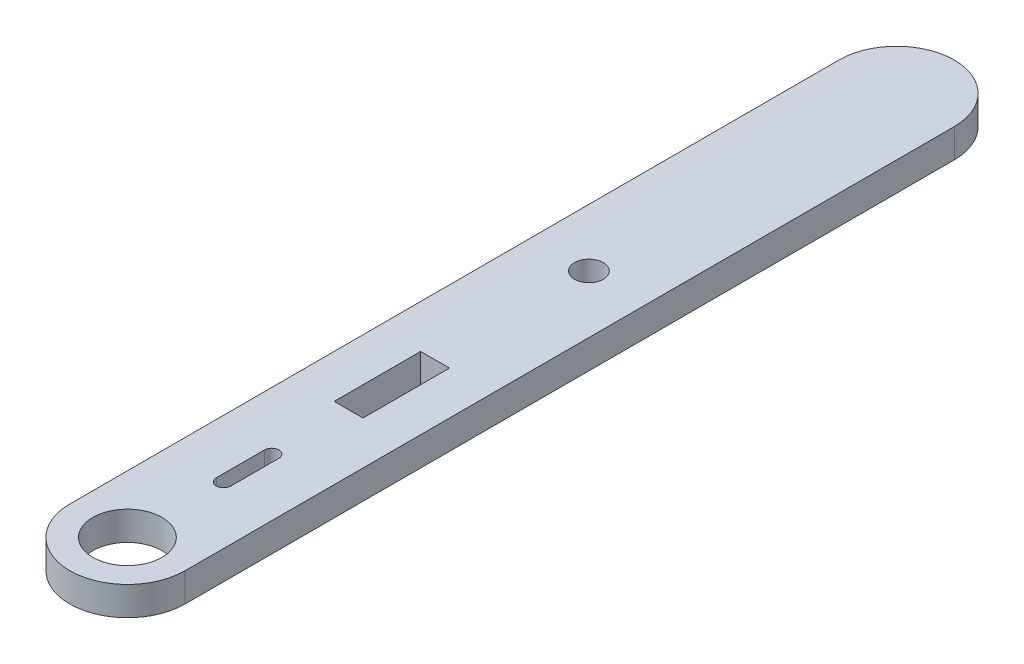
ISO-10303-21;
HEADER;
FILE_DESCRIPTION(('STEP AP214'),'2;1');
FILE_NAME('part.step','',(''),(''),'','','');
FILE_SCHEMA(('AUTOMOTIVE_DESIGN { 1 0 10303 214 1 1 1 1 }'));
ENDSEC;
DATA;
#1=APPLICATION_CONTEXT('core data for automotive mechanical design processes');
#2=APPLICATION_PROTOCOL_DEFINITION('international standard','automotive_design',2000,#1);
#3=PRODUCT_CONTEXT('',#1,'mechanical');
#4=PRODUCT('Part','Part','',(#3));
#5=PRODUCT_RELATED_PRODUCT_CATEGORY('part','',(#4));
#6=PRODUCT_DEFINITION_FORMATION('','',#4);
#7=PRODUCT_DEFINITION_CONTEXT('part definition',#1,'design');
#8=PRODUCT_DEFINITION('design','',#6,#7);
#9=PRODUCT_DEFINITION_SHAPE('','',#8);
#10=(LENGTH_UNIT() NAMED_UNIT(*) SI_UNIT(.MILLI.,.METRE.));
#11=(NAMED_UNIT(*) PLANE_ANGLE_UNIT() SI_UNIT($,.RADIAN.));
#12=(NAMED_UNIT(*) SI_UNIT($,.STERADIAN.) SOLID_ANGLE_UNIT());
#13=UNCERTAINTY_MEASURE_WITH_UNIT(LENGTH_MEASURE(1.E-05),#10,'distance_accuracy_value','');
#14=(GEOMETRIC_REPRESENTATION_CONTEXT(3) GLOBAL_UNCERTAINTY_ASSIGNED_CONTEXT((#13)) GLOBAL_UNIT_ASSIGNED_CONTEXT((#10,
#11,#12)) REPRESENTATION_CONTEXT('',''));
#15=CARTESIAN_POINT('',(0.,0.,0.));
#16=DIRECTION('',(0.,0.,1.));
#17=DIRECTION('',(1.,0.,0.));
#18=AXIS2_PLACEMENT_3D('',#15,#16,#17);
#19=CARTESIAN_POINT('',(6.30030000000004,3.,-88.2999260438786));
#20=DIRECTION('',(0.,1.,0.));
#21=DIRECTION('',(0.,0.,1.));
#22=AXIS2_PLACEMENT_3D('',#19,#20,#21);
#23=PLANE('',#22);
#24=CARTESIAN_POINT('',(6.30030000166648,3.,-56.2999760424166));
#25=DIRECTION('',(0.,1.,0.));
#26=DIRECTION('',(0.,0.,1.));
#27=AXIS2_PLACEMENT_3D('',#24,#25,#26);
#28=CIRCLE('',#27,1.50000000166676);
#29=CARTESIAN_POINT('',(6.30030000166648,3.,-54.7999760407499));
#30=VERTEX_POINT('',#29);
#31=EDGE_CURVE('E197',#30,#30,#28,.T.);
#32=ORIENTED_EDGE('',*,*,#31,.F.);
#33=EDGE_LOOP('',(#32));
#34=FACE_BOUND('',#33,.T.);
#35=DIRECTION('',(0.,0.,-1.));
#36=VECTOR('',#35,1.);
#37=CARTESIAN_POINT('',(12.3003,3.,-54.3259692671982));
#38=LINE('',#37,#36);
#39=CARTESIAN_POINT('',(12.3003000000001,3.,-8.29987604400681));
#40=VERTEX_POINT('',#39);
#41=CARTESIAN_POINT('',(12.3003,3.,-88.2998760437166));
#42=VERTEX_POINT('',#41);
#43=EDGE_CURVE('E203',#40,#42,#38,.T.);
#44=ORIENTED_EDGE('',*,*,#43,.T.);
#45=CARTESIAN_POINT('',(6.30030000000004,3.,-88.2999260438786));
#46=DIRECTION('',(0.,1.,0.));
#47=DIRECTION('',(0.,0.,1.));
#48=AXIS2_PLACEMENT_3D('',#45,#46,#47);
#49=CIRCLE('',#48,6.00000000020827);
#50=CARTESIAN_POINT('',(0.30030000000012,3.,-88.2999760440405));
#51=VERTEX_POINT('',#50);
#52=EDGE_CURVE('E205',#42,#51,#49,.T.);
#53=ORIENTED_EDGE('',*,*,#52,.T.);
#54=DIRECTION('',(0.,0.,1.));
#55=VECTOR('',#54,1.);
#56=CARTESIAN_POINT('',(0.300300000000132,3.,-88.2999760440405));
#57=LINE('',#56,#55);
#58=CARTESIAN_POINT('',(0.300300000000172,3.,-8.29987604406613));
#59=VERTEX_POINT('',#58);
#60=EDGE_CURVE('E208',#51,#59,#57,.T.);
#61=ORIENTED_EDGE('',*,*,#60,.T.);
#62=CARTESIAN_POINT('',(6.30030000000012,3.,-8.29992846702468));
#63=DIRECTION('',(0.,1.,0.));
#64=DIRECTION('',(0.,0.,1.));
#65=AXIS2_PLACEMENT_3D('',#62,#63,#64);
#66=CIRCLE('',#65,6.00000000022896);
#67=EDGE_CURVE('E210',#59,#40,#66,.T.);
#68=ORIENTED_EDGE('',*,*,#67,.T.);
#69=EDGE_LOOP('',(#44,#53,#61,#68));
#70=FACE_BOUND('',#69,.T.);
#71=CARTESIAN_POINT('',(6.30029999933328,3.,-8.2998760434166));
#72=DIRECTION('',(0.,1.,0.));
#73=DIRECTION('',(0.,0.,1.));
#74=AXIS2_PLACEMENT_3D('',#71,#72,#73);
#75=CIRCLE('',#74,3.6);
#76=CARTESIAN_POINT('',(6.30029999933328,3.,-4.6998760434166));
#77=VERTEX_POINT('',#76);
#78=EDGE_CURVE('E191',#77,#77,#75,.T.);
#79=ORIENTED_EDGE('',*,*,#78,.F.);
#80=EDGE_LOOP('',(#79));
#81=FACE_BOUND('',#80,.T.);
#82=DIRECTION('',(1.,0.,0.));
#83=VECTOR('',#82,1.);
#84=CARTESIAN_POINT('',(7.8003,3.,-31.2998760440833));
#85=LINE('',#84,#83);
#86=CARTESIAN_POINT('',(4.8003,3.,-31.2998760440833));
#87=VERTEX_POINT('',#86);
#88=CARTESIAN_POINT('',(7.8003,3.,-31.2998760440833));
#89=VERTEX_POINT('',#88);
#90=EDGE_CURVE('E162',#87,#89,#85,.T.);
#91=ORIENTED_EDGE('',*,*,#90,.F.);
#92=DIRECTION('',(0.,0.,1.));
#93=VECTOR('',#92,1.);
#94=CARTESIAN_POINT('',(4.8003,3.,-31.2998760440833));
#95=LINE('',#94,#93);
#96=CARTESIAN_POINT('',(4.8003,3.,-40.2998760440833));
#97=VERTEX_POINT('',#96);
#98=EDGE_CURVE('E160',#97,#87,#95,.T.);
#99=ORIENTED_EDGE('',*,*,#98,.F.);
#100=DIRECTION('',(-1.,0.,0.));
#101=VECTOR('',#100,1.);
#102=CARTESIAN_POINT('',(4.8003,3.,-40.2998760440833));
#103=LINE('',#102,#101);
#104=CARTESIAN_POINT('',(7.8003,3.,-40.2998760440833));
#105=VERTEX_POINT('',#104);
#106=EDGE_CURVE('E168',#105,#97,#103,.T.);
#107=ORIENTED_EDGE('',*,*,#106,.F.);
#108=DIRECTION('',(0.,0.,-1.));
#109=VECTOR('',#108,1.);
#110=CARTESIAN_POINT('',(7.8003,3.,-40.2998760440833));
#111=LINE('',#110,#109);
#112=EDGE_CURVE('E165',#89,#105,#111,.T.);
#113=ORIENTED_EDGE('',*,*,#112,.F.);
#114=EDGE_LOOP('',(#91,#99,#107,#113));
#115=FACE_BOUND('',#114,.T.);
#116=DIRECTION('',(-5.07185826301112E-10,0.,-1.));
#117=VECTOR('',#116,1.);
#118=CARTESIAN_POINT('',(7.05029999975801,3.,-18.2998798547108));
#119=LINE('',#118,#117);
#120=CARTESIAN_POINT('',(7.05029999975801,3.,-18.2998798547108));
#121=VERTEX_POINT('',#120);
#122=CARTESIAN_POINT('',(7.05029999722209,3.,-23.2998760413049));
#123=VERTEX_POINT('',#122);
#124=EDGE_CURVE('E132',#121,#123,#119,.T.);
#125=ORIENTED_EDGE('',*,*,#124,.F.);
#126=CARTESIAN_POINT('',(6.30030000000003,3.,-18.2998989078262));
#127=DIRECTION('',(0.,1.,0.));
#128=DIRECTION('',(0.,0.,1.));
#129=AXIS2_PLACEMENT_3D('',#126,#127,#128);
#130=CIRCLE('',#129,0.749999999999999);
#131=CARTESIAN_POINT('',(5.55030000024204,3.,-18.2998798547092));
#132=VERTEX_POINT('',#131);
#133=EDGE_CURVE('E124',#132,#121,#130,.T.);
#134=ORIENTED_EDGE('',*,*,#133,.F.);
#135=DIRECTION('',(-3.21981240250625E-10,0.,1.));
#136=VECTOR('',#135,1.);
#137=CARTESIAN_POINT('',(5.55030000185197,3.,-23.2999593769527));
#138=LINE('',#137,#136);
#139=CARTESIAN_POINT('',(5.55030000185197,3.,-23.2999593769527));
#140=VERTEX_POINT('',#139);
#141=EDGE_CURVE('E146',#140,#132,#138,.T.);
#142=ORIENTED_EDGE('',*,*,#141,.F.);
#143=CARTESIAN_POINT('',(6.30029999722209,3.,-23.2998760413049));
#144=DIRECTION('',(0.,1.,0.));
#145=DIRECTION('',(0.,0.,1.));
#146=AXIS2_PLACEMENT_3D('',#143,#144,#145);
#147=CIRCLE('',#146,0.749999999999999);
#148=EDGE_CURVE('E144',#123,#140,#147,.T.);
#149=ORIENTED_EDGE('',*,*,#148,.F.);
#150=EDGE_LOOP('',(#125,#134,#142,#149));
#151=FACE_BOUND('',#150,.T.);
#152=ADVANCED_FACE('F35',(#34,#70,#81,#115,#151),#23,.T.);
#153=CARTESIAN_POINT('',(6.30030000000004,0.,-88.2999260438786));
#154=DIRECTION('',(0.,1.,0.));
#155=DIRECTION('',(0.,0.,1.));
#156=AXIS2_PLACEMENT_3D('',#153,#154,#155);
#157=PLANE('',#156);
#158=DIRECTION('',(0.,0.,1.));
#159=VECTOR('',#158,1.);
#160=CARTESIAN_POINT('',(4.8003,0.,-31.2998760440833));
#161=LINE('',#160,#159);
#162=CARTESIAN_POINT('',(4.8003,0.,-40.2998760440833));
#163=VERTEX_POINT('',#162);
#164=CARTESIAN_POINT('',(4.8003,0.,-31.2998760440833));
#165=VERTEX_POINT('',#164);
#166=EDGE_CURVE('E140',#163,#165,#161,.T.);
#167=ORIENTED_EDGE('',*,*,#166,.T.);
#168=DIRECTION('',(1.,0.,0.));
#169=VECTOR('',#168,1.);
#170=CARTESIAN_POINT('',(7.8003,0.,-31.2998760440833));
#171=LINE('',#170,#169);
#172=CARTESIAN_POINT('',(7.8003,0.,-31.2998760440833));
#173=VERTEX_POINT('',#172);
#174=EDGE_CURVE('E173',#165,#173,#171,.T.);
#175=ORIENTED_EDGE('',*,*,#174,.T.);
#176=DIRECTION('',(0.,0.,-1.));
#177=VECTOR('',#176,1.);
#178=CARTESIAN_POINT('',(7.8003,0.,-40.2998760440833));
#179=LINE('',#178,#177);
#180=CARTESIAN_POINT('',(7.8003,0.,-40.2998760440833));
#181=VERTEX_POINT('',#180);
#182=EDGE_CURVE('E176',#173,#181,#179,.T.);
#183=ORIENTED_EDGE('',*,*,#182,.T.);
#184=DIRECTION('',(-1.,0.,0.));
#185=VECTOR('',#184,1.);
#186=CARTESIAN_POINT('',(4.8003,0.,-40.2998760440833));
#187=LINE('',#186,#185);
#188=EDGE_CURVE('E163',#181,#163,#187,.T.);
#189=ORIENTED_EDGE('',*,*,#188,.T.);
#190=EDGE_LOOP('',(#167,#175,#183,#189));
#191=FACE_BOUND('',#190,.T.);
#192=CARTESIAN_POINT('',(6.30030000000004,0.,-88.2999260438786));
#193=DIRECTION('',(0.,1.,0.));
#194=DIRECTION('',(0.,0.,1.));
#195=AXIS2_PLACEMENT_3D('',#192,#193,#194);
#196=CIRCLE('',#195,6.00000000020826);
#197=CARTESIAN_POINT('',(12.3003,0.,-88.2998760437166));
#198=VERTEX_POINT('',#197);
#199=CARTESIAN_POINT('',(0.30030000000012,0.,-88.2999760440405));
#200=VERTEX_POINT('',#199);
#201=EDGE_CURVE('E200',#198,#200,#196,.T.);
#202=ORIENTED_EDGE('',*,*,#201,.F.);
#203=DIRECTION('',(0.,0.,-1.));
#204=VECTOR('',#203,1.);
#205=CARTESIAN_POINT('',(12.3003,0.,-21.9746347267356));
#206=LINE('',#205,#204);
#207=CARTESIAN_POINT('',(12.3003000000001,0.,-8.29987604400681));
#208=VERTEX_POINT('',#207);
#209=EDGE_CURVE('E206',#208,#198,#206,.T.);
#210=ORIENTED_EDGE('',*,*,#209,.F.);
#211=CARTESIAN_POINT('',(6.30030000000012,0.,-8.29992846702468));
#212=DIRECTION('',(0.,1.,0.));
#213=DIRECTION('',(0.,0.,1.));
#214=AXIS2_PLACEMENT_3D('',#211,#212,#213);
#215=CIRCLE('',#214,6.00000000022896);
#216=CARTESIAN_POINT('',(0.300300000000172,0.,-8.29987604406613));
#217=VERTEX_POINT('',#216);
#218=EDGE_CURVE('E217',#217,#208,#215,.T.);
#219=ORIENTED_EDGE('',*,*,#218,.F.);
#220=DIRECTION('',(0.,0.,1.));
#221=VECTOR('',#220,1.);
#222=CARTESIAN_POINT('',(0.300300000000132,0.,-88.2999760440405));
#223=LINE('',#222,#221);
#224=EDGE_CURVE('E215',#200,#217,#223,.T.);
#225=ORIENTED_EDGE('',*,*,#224,.F.);
#226=EDGE_LOOP('',(#202,#210,#219,#225));
#227=FACE_BOUND('',#226,.T.);
#228=CARTESIAN_POINT('',(6.30030000166648,0.,-56.2999760424166));
#229=DIRECTION('',(0.,1.,0.));
#230=DIRECTION('',(0.,0.,1.));
#231=AXIS2_PLACEMENT_3D('',#228,#229,#230);
#232=CIRCLE('',#231,1.50000000166676);
#233=CARTESIAN_POINT('',(6.30030000166648,0.,-54.7999760407499));
#234=VERTEX_POINT('',#233);
#235=EDGE_CURVE('E194',#234,#234,#232,.T.);
#236=ORIENTED_EDGE('',*,*,#235,.T.);
#237=EDGE_LOOP('',(#236));
#238=FACE_BOUND('',#237,.T.);
#239=CARTESIAN_POINT('',(6.30029999933328,0.,-8.2998760434166));
#240=DIRECTION('',(0.,1.,0.));
#241=DIRECTION('',(0.,0.,1.));
#242=AXIS2_PLACEMENT_3D('',#239,#240,#241);
#243=CIRCLE('',#242,3.6);
#244=CARTESIAN_POINT('',(6.30029999933328,0.,-4.6998760434166));
#245=VERTEX_POINT('',#244);
#246=EDGE_CURVE('E190',#245,#245,#243,.T.);
#247=ORIENTED_EDGE('',*,*,#246,.T.);
#248=EDGE_LOOP('',(#247));
#249=FACE_BOUND('',#248,.T.);
#250=CARTESIAN_POINT('',(6.30030000000003,0.,-18.2998989078262));
#251=DIRECTION('',(0.,1.,0.));
#252=DIRECTION('',(0.,0.,1.));
#253=AXIS2_PLACEMENT_3D('',#250,#251,#252);
#254=CIRCLE('',#253,0.749999999999999);
#255=CARTESIAN_POINT('',(5.55030000024204,0.,-18.2998798547092));
#256=VERTEX_POINT('',#255);
#257=CARTESIAN_POINT('',(7.05029999975801,0.,-18.2998798547108));
#258=VERTEX_POINT('',#257);
#259=EDGE_CURVE('E58',#256,#258,#254,.T.);
#260=ORIENTED_EDGE('',*,*,#259,.T.);
#261=DIRECTION('',(-5.07185826301112E-10,0.,-1.));
#262=VECTOR('',#261,1.);
#263=CARTESIAN_POINT('',(7.05029999975801,0.,-18.2998798547108));
#264=LINE('',#263,#262);
#265=CARTESIAN_POINT('',(7.05029999722209,0.,-23.2998760413049));
#266=VERTEX_POINT('',#265);
#267=EDGE_CURVE('E139',#258,#266,#264,.T.);
#268=ORIENTED_EDGE('',*,*,#267,.T.);
#269=CARTESIAN_POINT('',(6.30029999722209,0.,-23.2998760413049));
#270=DIRECTION('',(0.,1.,0.));
#271=DIRECTION('',(0.,0.,1.));
#272=AXIS2_PLACEMENT_3D('',#269,#270,#271);
#273=CIRCLE('',#272,0.749999999999999);
#274=CARTESIAN_POINT('',(5.55030000185197,0.,-23.2999593769527));
#275=VERTEX_POINT('',#274);
#276=EDGE_CURVE('E152',#266,#275,#273,.T.);
#277=ORIENTED_EDGE('',*,*,#276,.T.);
#278=DIRECTION('',(-3.21981240250625E-10,0.,1.));
#279=VECTOR('',#278,1.);
#280=CARTESIAN_POINT('',(5.55030000185197,0.,-23.2999593769527));
#281=LINE('',#280,#279);
#282=EDGE_CURVE('E133',#275,#256,#281,.T.);
#283=ORIENTED_EDGE('',*,*,#282,.T.);
#284=EDGE_LOOP('',(#260,#268,#277,#283));
#285=FACE_BOUND('',#284,.T.);
#286=ADVANCED_FACE('F237',(#191,#227,#238,#249,#285),#157,.F.);
#287=CARTESIAN_POINT('',(6.30030000000004,3.,-88.2999260438786));
#288=DIRECTION('',(0.,-1.,0.));
#289=DIRECTION('',(0.,0.,-1.));
#290=AXIS2_PLACEMENT_3D('',#287,#288,#289);
#291=CYLINDRICAL_SURFACE('',#290,6.00000000020826);
#292=ORIENTED_EDGE('',*,*,#201,.T.);
#293=DIRECTION('',(0.,-1.,0.));
#294=VECTOR('',#293,1.);
#295=CARTESIAN_POINT('',(0.30030000000012,3.,-88.2999760440405));
#296=LINE('',#295,#294);
#297=EDGE_CURVE('E43',#51,#200,#296,.T.);
#298=ORIENTED_EDGE('',*,*,#297,.F.);
#299=ORIENTED_EDGE('',*,*,#52,.F.);
#300=DIRECTION('',(0.,-1.,0.));
#301=VECTOR('',#300,1.);
#302=CARTESIAN_POINT('',(12.3003,3.,-88.2998760437166));
#303=LINE('',#302,#301);
#304=EDGE_CURVE('E11',#42,#198,#303,.T.);
#305=ORIENTED_EDGE('',*,*,#304,.T.);
#306=EDGE_LOOP('',(#292,#298,#299,#305));
#307=FACE_BOUND('',#306,.T.);
#308=ADVANCED_FACE('F37',(#307),#291,.T.);
#309=CARTESIAN_POINT('',(0.300300000000132,3.,-88.2999760440405));
#310=DIRECTION('',(1.,0.,0.));
#311=DIRECTION('',(0.,0.,-1.));
#312=AXIS2_PLACEMENT_3D('',#309,#310,#311);
#313=PLANE('',#312);
#314=ORIENTED_EDGE('',*,*,#224,.T.);
#315=DIRECTION('',(0.,-1.,0.));
#316=VECTOR('',#315,1.);
#317=CARTESIAN_POINT('',(0.300300000000172,3.,-8.29987604406613));
#318=LINE('',#317,#316);
#319=EDGE_CURVE('E223',#59,#217,#318,.T.);
#320=ORIENTED_EDGE('',*,*,#319,.F.);
#321=ORIENTED_EDGE('',*,*,#60,.F.);
#322=ORIENTED_EDGE('',*,*,#297,.T.);
#323=EDGE_LOOP('',(#314,#320,#321,#322));
#324=FACE_BOUND('',#323,.T.);
#325=ADVANCED_FACE('F230',(#324),#313,.F.);
#326=CARTESIAN_POINT('',(6.30030000000012,3.,-8.29992846702468));
#327=DIRECTION('',(0.,-1.,0.));
#328=DIRECTION('',(0.,0.,-1.));
#329=AXIS2_PLACEMENT_3D('',#326,#327,#328);
#330=CYLINDRICAL_SURFACE('',#329,6.00000000022896);
#331=ORIENTED_EDGE('',*,*,#218,.T.);
#332=DIRECTION('',(0.,-1.,0.));
#333=VECTOR('',#332,1.);
#334=CARTESIAN_POINT('',(12.3003000000001,3.,-8.29987604400681));
#335=LINE('',#334,#333);
#336=EDGE_CURVE('E213',#40,#208,#335,.T.);
#337=ORIENTED_EDGE('',*,*,#336,.F.);
#338=ORIENTED_EDGE('',*,*,#67,.F.);
#339=ORIENTED_EDGE('',*,*,#319,.T.);
#340=EDGE_LOOP('',(#331,#337,#338,#339));
#341=FACE_BOUND('',#340,.T.);
#342=ADVANCED_FACE('F241',(#341),#330,.T.);
#343=CARTESIAN_POINT('',(12.3003,3.,-21.9746347267356));
#344=DIRECTION('',(-1.,0.,0.));
#345=DIRECTION('',(0.,0.,1.));
#346=AXIS2_PLACEMENT_3D('',#343,#344,#345);
#347=PLANE('',#346);
#348=ORIENTED_EDGE('',*,*,#209,.T.);
#349=ORIENTED_EDGE('',*,*,#304,.F.);
#350=ORIENTED_EDGE('',*,*,#43,.F.);
#351=ORIENTED_EDGE('',*,*,#336,.T.);
#352=EDGE_LOOP('',(#348,#349,#350,#351));
#353=FACE_BOUND('',#352,.T.);
#354=ADVANCED_FACE('F244',(#353),#347,.F.);
#355=CARTESIAN_POINT('',(6.30030000166648,3.,-56.2999760424166));
#356=DIRECTION('',(0.,-1.,0.));
#357=DIRECTION('',(0.,0.,-1.));
#358=AXIS2_PLACEMENT_3D('',#355,#356,#357);
#359=CYLINDRICAL_SURFACE('',#358,1.50000000166676);
#360=ORIENTED_EDGE('',*,*,#31,.T.);
#361=EDGE_LOOP('',(#360));
#362=FACE_BOUND('',#361,.T.);
#363=ORIENTED_EDGE('',*,*,#235,.F.);
#364=EDGE_LOOP('',(#363));
#365=FACE_BOUND('',#364,.T.);
#366=ADVANCED_FACE('F262',(#362,#365),#359,.F.);
#367=CARTESIAN_POINT('',(6.30029999933328,3.,-8.2998760434166));
#368=DIRECTION('',(0.,-1.,0.));
#369=DIRECTION('',(0.,0.,-1.));
#370=AXIS2_PLACEMENT_3D('',#367,#368,#369);
#371=CYLINDRICAL_SURFACE('',#370,3.6);
#372=ORIENTED_EDGE('',*,*,#78,.T.);
#373=EDGE_LOOP('',(#372));
#374=FACE_BOUND('',#373,.T.);
#375=ORIENTED_EDGE('',*,*,#246,.F.);
#376=EDGE_LOOP('',(#375));
#377=FACE_BOUND('',#376,.T.);
#378=ADVANCED_FACE('F282',(#374,#377),#371,.F.);
#379=CARTESIAN_POINT('',(4.8003,3.,-31.2998760440833));
#380=DIRECTION('',(1.,0.,0.));
#381=DIRECTION('',(0.,0.,-1.));
#382=AXIS2_PLACEMENT_3D('',#379,#380,#381);
#383=PLANE('',#382);
#384=ORIENTED_EDGE('',*,*,#166,.F.);
#385=DIRECTION('',(0.,-1.,0.));
#386=VECTOR('',#385,1.);
#387=CARTESIAN_POINT('',(4.8003,3.,-40.2998760440833));
#388=LINE('',#387,#386);
#389=EDGE_CURVE('E170',#97,#163,#388,.T.);
#390=ORIENTED_EDGE('',*,*,#389,.F.);
#391=ORIENTED_EDGE('',*,*,#98,.T.);
#392=DIRECTION('',(0.,-1.,0.));
#393=VECTOR('',#392,1.);
#394=CARTESIAN_POINT('',(4.8003,3.,-31.2998760440833));
#395=LINE('',#394,#393);
#396=EDGE_CURVE('E187',#87,#165,#395,.T.);
#397=ORIENTED_EDGE('',*,*,#396,.T.);
#398=EDGE_LOOP('',(#384,#390,#391,#397));
#399=FACE_BOUND('',#398,.T.);
#400=ADVANCED_FACE('F289',(#399),#383,.T.);
#401=CARTESIAN_POINT('',(7.8003,3.,-31.2998760440833));
#402=DIRECTION('',(0.,0.,-1.));
#403=DIRECTION('',(-1.,0.,0.));
#404=AXIS2_PLACEMENT_3D('',#401,#402,#403);
#405=PLANE('',#404);
#406=ORIENTED_EDGE('',*,*,#174,.F.);
#407=ORIENTED_EDGE('',*,*,#396,.F.);
#408=ORIENTED_EDGE('',*,*,#90,.T.);
#409=DIRECTION('',(0.,-1.,0.));
#410=VECTOR('',#409,1.);
#411=CARTESIAN_POINT('',(7.8003,3.,-31.2998760440833));
#412=LINE('',#411,#410);
#413=EDGE_CURVE('E185',#89,#173,#412,.T.);
#414=ORIENTED_EDGE('',*,*,#413,.T.);
#415=EDGE_LOOP('',(#406,#407,#408,#414));
#416=FACE_BOUND('',#415,.T.);
#417=ADVANCED_FACE('F296',(#416),#405,.T.);
#418=CARTESIAN_POINT('',(7.8003,3.,-40.2998760440833));
#419=DIRECTION('',(-1.,0.,0.));
#420=DIRECTION('',(0.,0.,1.));
#421=AXIS2_PLACEMENT_3D('',#418,#419,#420);
#422=PLANE('',#421);
#423=ORIENTED_EDGE('',*,*,#182,.F.);
#424=ORIENTED_EDGE('',*,*,#413,.F.);
#425=ORIENTED_EDGE('',*,*,#112,.T.);
#426=DIRECTION('',(0.,-1.,0.));
#427=VECTOR('',#426,1.);
#428=CARTESIAN_POINT('',(7.8003,3.,-40.2998760440833));
#429=LINE('',#428,#427);
#430=EDGE_CURVE('E183',#105,#181,#429,.T.);
#431=ORIENTED_EDGE('',*,*,#430,.T.);
#432=EDGE_LOOP('',(#423,#424,#425,#431));
#433=FACE_BOUND('',#432,.T.);
#434=ADVANCED_FACE('F304',(#433),#422,.T.);
#435=CARTESIAN_POINT('',(4.8003,3.,-40.2998760440833));
#436=DIRECTION('',(0.,0.,1.));
#437=DIRECTION('',(1.,0.,0.));
#438=AXIS2_PLACEMENT_3D('',#435,#436,#437);
#439=PLANE('',#438);
#440=ORIENTED_EDGE('',*,*,#188,.F.);
#441=ORIENTED_EDGE('',*,*,#430,.F.);
#442=ORIENTED_EDGE('',*,*,#106,.T.);
#443=ORIENTED_EDGE('',*,*,#389,.T.);
#444=EDGE_LOOP('',(#440,#441,#442,#443));
#445=FACE_BOUND('',#444,.T.);
#446=ADVANCED_FACE('F312',(#445),#439,.T.);
#447=CARTESIAN_POINT('',(6.30030000000003,3.,-18.2998989078262));
#448=DIRECTION('',(0.,-1.,0.));
#449=DIRECTION('',(0.,0.,-1.));
#450=AXIS2_PLACEMENT_3D('',#447,#448,#449);
#451=CYLINDRICAL_SURFACE('',#450,0.749999999999999);
#452=ORIENTED_EDGE('',*,*,#259,.F.);
#453=DIRECTION('',(0.,-1.,0.));
#454=VECTOR('',#453,1.);
#455=CARTESIAN_POINT('',(5.55030000024204,3.,-18.2998798547092));
#456=LINE('',#455,#454);
#457=EDGE_CURVE('E128',#132,#256,#456,.T.);
#458=ORIENTED_EDGE('',*,*,#457,.F.);
#459=ORIENTED_EDGE('',*,*,#133,.T.);
#460=DIRECTION('',(0.,-1.,0.));
#461=VECTOR('',#460,1.);
#462=CARTESIAN_POINT('',(7.05029999975801,3.,-18.2998798547108));
#463=LINE('',#462,#461);
#464=EDGE_CURVE('E127',#121,#258,#463,.T.);
#465=ORIENTED_EDGE('',*,*,#464,.T.);
#466=EDGE_LOOP('',(#452,#458,#459,#465));
#467=FACE_BOUND('',#466,.T.);
#468=ADVANCED_FACE('F126',(#467),#451,.F.);
#469=CARTESIAN_POINT('',(7.05029999975801,3.,-18.2998798547108));
#470=DIRECTION('',(-1.,0.,5.07185826301112E-10));
#471=DIRECTION('',(5.07185826301112E-10,0.,1.));
#472=AXIS2_PLACEMENT_3D('',#469,#470,#471);
#473=PLANE('',#472);
#474=ORIENTED_EDGE('',*,*,#267,.F.);
#475=ORIENTED_EDGE('',*,*,#464,.F.);
#476=ORIENTED_EDGE('',*,*,#124,.T.);
#477=DIRECTION('',(0.,-1.,0.));
#478=VECTOR('',#477,1.);
#479=CARTESIAN_POINT('',(7.05029999722209,3.,-23.2998760413049));
#480=LINE('',#479,#478);
#481=EDGE_CURVE('E141',#123,#266,#480,.T.);
#482=ORIENTED_EDGE('',*,*,#481,.T.);
#483=EDGE_LOOP('',(#474,#475,#476,#482));
#484=FACE_BOUND('',#483,.T.);
#485=ADVANCED_FACE('F136',(#484),#473,.T.);
#486=CARTESIAN_POINT('',(6.30029999722209,3.,-23.2998760413049));
#487=DIRECTION('',(0.,-1.,0.));
#488=DIRECTION('',(0.,0.,-1.));
#489=AXIS2_PLACEMENT_3D('',#486,#487,#488);
#490=CYLINDRICAL_SURFACE('',#489,0.749999999999999);
#491=ORIENTED_EDGE('',*,*,#276,.F.);
#492=ORIENTED_EDGE('',*,*,#481,.F.);
#493=ORIENTED_EDGE('',*,*,#148,.T.);
#494=DIRECTION('',(0.,-1.,0.));
#495=VECTOR('',#494,1.);
#496=CARTESIAN_POINT('',(5.55030000185197,3.,-23.2999593769527));
#497=LINE('',#496,#495);
#498=EDGE_CURVE('E50',#140,#275,#497,.T.);
#499=ORIENTED_EDGE('',*,*,#498,.T.);
#500=EDGE_LOOP('',(#491,#492,#493,#499));
#501=FACE_BOUND('',#500,.T.);
#502=ADVANCED_FACE('F333',(#501),#490,.F.);
#503=CARTESIAN_POINT('',(5.55030000185197,3.,-23.2999593769527));
#504=DIRECTION('',(1.,0.,3.21981240250625E-10));
#505=DIRECTION('',(3.21981240250625E-10,0.,-1.));
#506=AXIS2_PLACEMENT_3D('',#503,#504,#505);
#507=PLANE('',#506);
#508=ORIENTED_EDGE('',*,*,#282,.F.);
#509=ORIENTED_EDGE('',*,*,#498,.F.);
#510=ORIENTED_EDGE('',*,*,#141,.T.);
#511=ORIENTED_EDGE('',*,*,#457,.T.);
#512=EDGE_LOOP('',(#508,#509,#510,#511));
#513=FACE_BOUND('',#512,.T.);
#514=ADVANCED_FACE('F340',(#513),#507,.T.);
#515=CLOSED_SHELL('',(#152,#286,#308,#325,#342,#354,#366,#378,#400,#417,#434,#446,#468,#485,
#502,#514));
#516=MANIFOLD_SOLID_BREP('B2',#515);
#517=ADVANCED_BREP_SHAPE_REPRESENTATION('',(#18,#516),#14);
#518=SHAPE_DEFINITION_REPRESENTATION(#9,#517);
ENDSEC;
END-ISO-10303-21;
